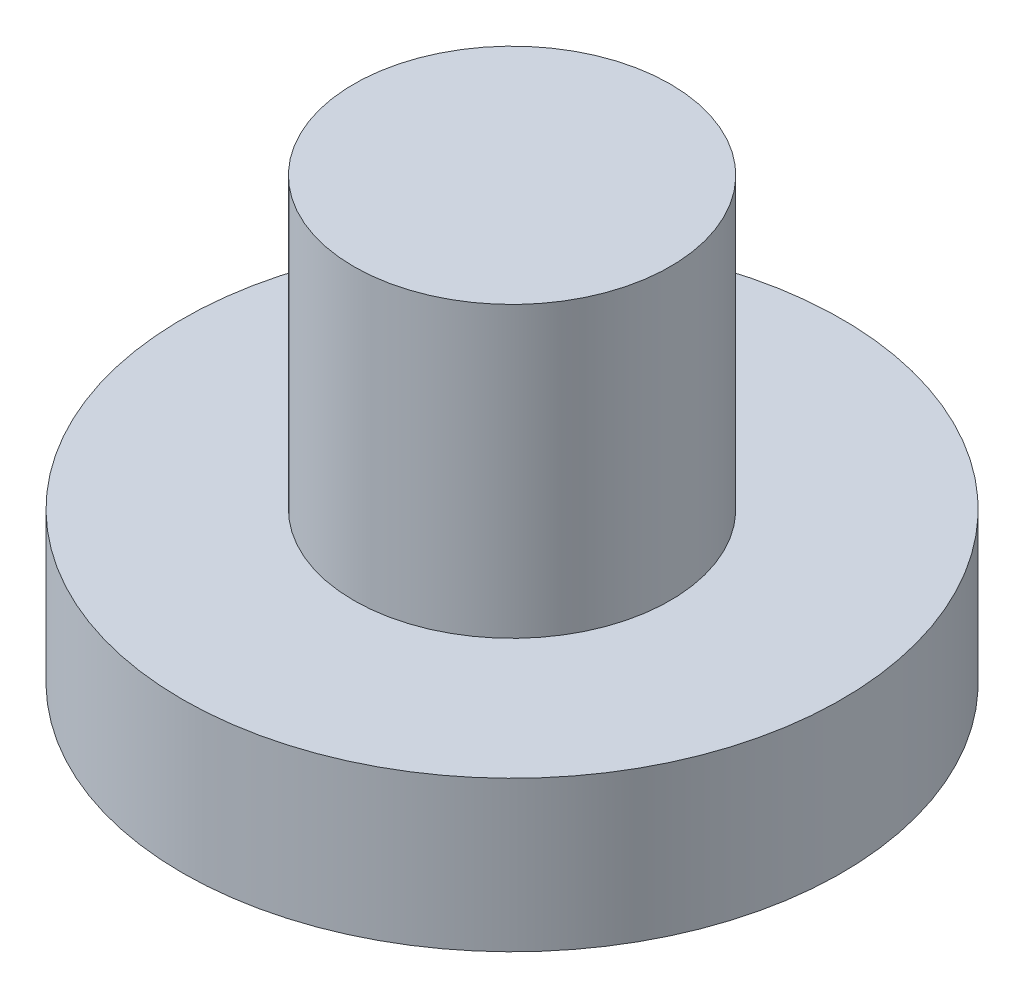
ISO-10303-21;
HEADER;
FILE_DESCRIPTION(('STEP AP214'),'2;1');
FILE_NAME('part.step','',(''),(''),'','','');
FILE_SCHEMA(('AUTOMOTIVE_DESIGN { 1 0 10303 214 1 1 1 1 }'));
ENDSEC;
DATA;
#1=APPLICATION_CONTEXT('core data for automotive mechanical design processes');
#2=APPLICATION_PROTOCOL_DEFINITION('international standard','automotive_design',2000,#1);
#3=PRODUCT_CONTEXT('',#1,'mechanical');
#4=PRODUCT('Part','Part','',(#3));
#5=PRODUCT_RELATED_PRODUCT_CATEGORY('part','',(#4));
#6=PRODUCT_DEFINITION_FORMATION('','',#4);
#7=PRODUCT_DEFINITION_CONTEXT('part definition',#1,'design');
#8=PRODUCT_DEFINITION('design','',#6,#7);
#9=PRODUCT_DEFINITION_SHAPE('','',#8);
#10=(LENGTH_UNIT() NAMED_UNIT(*) SI_UNIT(.MILLI.,.METRE.));
#11=(NAMED_UNIT(*) PLANE_ANGLE_UNIT() SI_UNIT($,.RADIAN.));
#12=(NAMED_UNIT(*) SI_UNIT($,.STERADIAN.) SOLID_ANGLE_UNIT());
#13=UNCERTAINTY_MEASURE_WITH_UNIT(LENGTH_MEASURE(1.E-05),#10,'distance_accuracy_value','');
#14=(GEOMETRIC_REPRESENTATION_CONTEXT(3) GLOBAL_UNCERTAINTY_ASSIGNED_CONTEXT((#13)) GLOBAL_UNIT_ASSIGNED_CONTEXT((#10,
#11,#12)) REPRESENTATION_CONTEXT('',''));
#15=CARTESIAN_POINT('',(0.,0.,0.));
#16=DIRECTION('',(0.,0.,1.));
#17=DIRECTION('',(1.,0.,0.));
#18=AXIS2_PLACEMENT_3D('',#15,#16,#17);
#19=CARTESIAN_POINT('',(0.,3.42,0.));
#20=DIRECTION('',(0.,1.,0.));
#21=DIRECTION('',(0.,0.,1.));
#22=AXIS2_PLACEMENT_3D('',#19,#20,#21);
#23=PLANE('',#22);
#24=CARTESIAN_POINT('',(0.,3.42,0.));
#25=DIRECTION('',(0.,1.,0.));
#26=DIRECTION('',(0.,0.,1.));
#27=AXIS2_PLACEMENT_3D('',#24,#25,#26);
#28=CIRCLE('',#27,7.5);
#29=CARTESIAN_POINT('',(0.,3.42,7.5));
#30=VERTEX_POINT('',#29);
#31=EDGE_CURVE('E10',#30,#30,#28,.T.);
#32=ORIENTED_EDGE('',*,*,#31,.T.);
#33=EDGE_LOOP('',(#32));
#34=FACE_BOUND('',#33,.T.);
#35=CARTESIAN_POINT('',(0.,3.42,0.));
#36=DIRECTION('',(0.,1.,0.));
#37=DIRECTION('',(0.,0.,1.));
#38=AXIS2_PLACEMENT_3D('',#35,#36,#37);
#39=CIRCLE('',#38,3.6);
#40=CARTESIAN_POINT('',(0.,3.42,3.6));
#41=VERTEX_POINT('',#40);
#42=EDGE_CURVE('E52',#41,#41,#39,.T.);
#43=ORIENTED_EDGE('',*,*,#42,.F.);
#44=EDGE_LOOP('',(#43));
#45=FACE_BOUND('',#44,.T.);
#46=ADVANCED_FACE('F39',(#34,#45),#23,.T.);
#47=CARTESIAN_POINT('',(0.,0.,0.));
#48=DIRECTION('',(0.,1.,0.));
#49=DIRECTION('',(0.,0.,1.));
#50=AXIS2_PLACEMENT_3D('',#47,#48,#49);
#51=PLANE('',#50);
#52=CARTESIAN_POINT('',(0.,0.,0.));
#53=DIRECTION('',(0.,1.,0.));
#54=DIRECTION('',(0.,0.,1.));
#55=AXIS2_PLACEMENT_3D('',#52,#53,#54);
#56=CIRCLE('',#55,7.5);
#57=CARTESIAN_POINT('',(0.,0.,7.5));
#58=VERTEX_POINT('',#57);
#59=EDGE_CURVE('E43',#58,#58,#56,.T.);
#60=ORIENTED_EDGE('',*,*,#59,.F.);
#61=EDGE_LOOP('',(#60));
#62=FACE_BOUND('',#61,.T.);
#63=ADVANCED_FACE('F73',(#62),#51,.F.);
#64=CARTESIAN_POINT('',(0.,3.42,0.));
#65=DIRECTION('',(0.,-1.,0.));
#66=DIRECTION('',(0.,0.,-1.));
#67=AXIS2_PLACEMENT_3D('',#64,#65,#66);
#68=CYLINDRICAL_SURFACE('',#67,7.5);
#69=ORIENTED_EDGE('',*,*,#31,.F.);
#70=EDGE_LOOP('',(#69));
#71=FACE_BOUND('',#70,.T.);
#72=ORIENTED_EDGE('',*,*,#59,.T.);
#73=EDGE_LOOP('',(#72));
#74=FACE_BOUND('',#73,.T.);
#75=ADVANCED_FACE('F41',(#71,#74),#68,.T.);
#76=CARTESIAN_POINT('',(0.,10.,0.));
#77=DIRECTION('',(0.,-1.,0.));
#78=DIRECTION('',(0.,0.,-1.));
#79=AXIS2_PLACEMENT_3D('',#76,#77,#78);
#80=CYLINDRICAL_SURFACE('',#79,3.6);
#81=ORIENTED_EDGE('',*,*,#42,.T.);
#82=EDGE_LOOP('',(#81));
#83=FACE_BOUND('',#82,.T.);
#84=CARTESIAN_POINT('',(0.,10.,0.));
#85=DIRECTION('',(0.,1.,0.));
#86=DIRECTION('',(0.,0.,1.));
#87=AXIS2_PLACEMENT_3D('',#84,#85,#86);
#88=CIRCLE('',#87,3.6);
#89=CARTESIAN_POINT('',(0.,10.,3.6));
#90=VERTEX_POINT('',#89);
#91=EDGE_CURVE('E57',#90,#90,#88,.T.);
#92=ORIENTED_EDGE('',*,*,#91,.F.);
#93=EDGE_LOOP('',(#92));
#94=FACE_BOUND('',#93,.T.);
#95=ADVANCED_FACE('F64',(#83,#94),#80,.T.);
#96=CARTESIAN_POINT('',(0.,10.,0.));
#97=DIRECTION('',(0.,1.,0.));
#98=DIRECTION('',(0.,0.,1.));
#99=AXIS2_PLACEMENT_3D('',#96,#97,#98);
#100=PLANE('',#99);
#101=ORIENTED_EDGE('',*,*,#91,.T.);
#102=EDGE_LOOP('',(#101));
#103=FACE_BOUND('',#102,.T.);
#104=ADVANCED_FACE('F62',(#103),#100,.T.);
#105=CLOSED_SHELL('',(#46,#63,#75,#95,#104));
#106=MANIFOLD_SOLID_BREP('B2',#105);
#107=ADVANCED_BREP_SHAPE_REPRESENTATION('',(#18,#106),#14);
#108=SHAPE_DEFINITION_REPRESENTATION(#9,#107);
ENDSEC;
END-ISO-10303-21;
